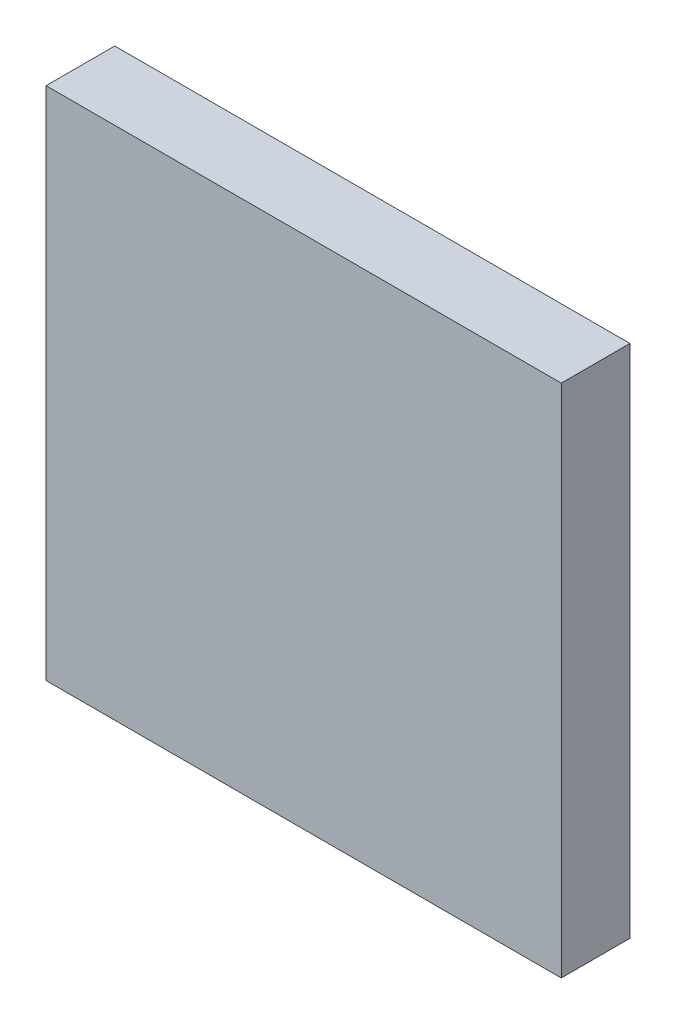
ISO-10303-21;
HEADER;
FILE_DESCRIPTION(('STEP AP214'),'2;1');
FILE_NAME('part.step','',(''),(''),'','','');
FILE_SCHEMA(('AUTOMOTIVE_DESIGN { 1 0 10303 214 1 1 1 1 }'));
ENDSEC;
DATA;
#1=APPLICATION_CONTEXT('core data for automotive mechanical design processes');
#2=APPLICATION_PROTOCOL_DEFINITION('international standard','automotive_design',2000,#1);
#3=PRODUCT_CONTEXT('',#1,'mechanical');
#4=PRODUCT('Part','Part','',(#3));
#5=PRODUCT_RELATED_PRODUCT_CATEGORY('part','',(#4));
#6=PRODUCT_DEFINITION_FORMATION('','',#4);
#7=PRODUCT_DEFINITION_CONTEXT('part definition',#1,'design');
#8=PRODUCT_DEFINITION('design','',#6,#7);
#9=PRODUCT_DEFINITION_SHAPE('','',#8);
#10=(LENGTH_UNIT() NAMED_UNIT(*) SI_UNIT(.MILLI.,.METRE.));
#11=(NAMED_UNIT(*) PLANE_ANGLE_UNIT() SI_UNIT($,.RADIAN.));
#12=(NAMED_UNIT(*) SI_UNIT($,.STERADIAN.) SOLID_ANGLE_UNIT());
#13=UNCERTAINTY_MEASURE_WITH_UNIT(LENGTH_MEASURE(1.E-05),#10,'distance_accuracy_value','');
#14=(GEOMETRIC_REPRESENTATION_CONTEXT(3) GLOBAL_UNCERTAINTY_ASSIGNED_CONTEXT((#13)) GLOBAL_UNIT_ASSIGNED_CONTEXT((#10,
#11,#12)) REPRESENTATION_CONTEXT('',''));
#15=CARTESIAN_POINT('',(0.,0.,0.));
#16=DIRECTION('',(0.,0.,1.));
#17=DIRECTION('',(1.,0.,0.));
#18=AXIS2_PLACEMENT_3D('',#15,#16,#17);
#19=CARTESIAN_POINT('',(75.,0.,170.));
#20=DIRECTION('',(-1.,0.,0.));
#21=DIRECTION('',(0.,-1.,0.));
#22=AXIS2_PLACEMENT_3D('',#19,#20,#21);
#23=PLANE('',#22);
#24=DIRECTION('',(0.,1.,0.));
#25=VECTOR('',#24,1.);
#26=CARTESIAN_POINT('',(75.,0.,150.));
#27=LINE('',#26,#25);
#28=CARTESIAN_POINT('',(75.,-150.,150.));
#29=VERTEX_POINT('',#28);
#30=CARTESIAN_POINT('',(75.,0.,150.));
#31=VERTEX_POINT('',#30);
#32=EDGE_CURVE('E113',#29,#31,#27,.T.);
#33=ORIENTED_EDGE('',*,*,#32,.T.);
#34=DIRECTION('',(0.,0.,-1.));
#35=VECTOR('',#34,1.);
#36=CARTESIAN_POINT('',(75.,0.,170.));
#37=LINE('',#36,#35);
#38=CARTESIAN_POINT('',(75.,0.,170.));
#39=VERTEX_POINT('',#38);
#40=EDGE_CURVE('E11',#39,#31,#37,.T.);
#41=ORIENTED_EDGE('',*,*,#40,.F.);
#42=DIRECTION('',(0.,1.,0.));
#43=VECTOR('',#42,1.);
#44=CARTESIAN_POINT('',(75.,0.,170.));
#45=LINE('',#44,#43);
#46=CARTESIAN_POINT('',(75.,-150.,170.));
#47=VERTEX_POINT('',#46);
#48=EDGE_CURVE('E97',#47,#39,#45,.T.);
#49=ORIENTED_EDGE('',*,*,#48,.F.);
#50=DIRECTION('',(0.,0.,-1.));
#51=VECTOR('',#50,1.);
#52=CARTESIAN_POINT('',(75.,-150.,170.));
#53=LINE('',#52,#51);
#54=EDGE_CURVE('E109',#47,#29,#53,.T.);
#55=ORIENTED_EDGE('',*,*,#54,.T.);
#56=EDGE_LOOP('',(#33,#41,#49,#55));
#57=FACE_BOUND('',#56,.T.);
#58=ADVANCED_FACE('F45',(#57),#23,.F.);
#59=CARTESIAN_POINT('',(-75.,0.,170.));
#60=DIRECTION('',(0.,-1.,0.));
#61=DIRECTION('',(0.,0.,-1.));
#62=AXIS2_PLACEMENT_3D('',#59,#60,#61);
#63=PLANE('',#62);
#64=DIRECTION('',(-1.,0.,0.));
#65=VECTOR('',#64,1.);
#66=CARTESIAN_POINT('',(-75.,0.,150.));
#67=LINE('',#66,#65);
#68=CARTESIAN_POINT('',(-75.,0.,150.));
#69=VERTEX_POINT('',#68);
#70=EDGE_CURVE('E102',#31,#69,#67,.T.);
#71=ORIENTED_EDGE('',*,*,#70,.T.);
#72=DIRECTION('',(0.,0.,-1.));
#73=VECTOR('',#72,1.);
#74=CARTESIAN_POINT('',(-75.,0.,170.));
#75=LINE('',#74,#73);
#76=CARTESIAN_POINT('',(-75.,0.,170.));
#77=VERTEX_POINT('',#76);
#78=EDGE_CURVE('E54',#77,#69,#75,.T.);
#79=ORIENTED_EDGE('',*,*,#78,.F.);
#80=DIRECTION('',(-1.,0.,0.));
#81=VECTOR('',#80,1.);
#82=CARTESIAN_POINT('',(-75.,0.,170.));
#83=LINE('',#82,#81);
#84=EDGE_CURVE('E92',#39,#77,#83,.T.);
#85=ORIENTED_EDGE('',*,*,#84,.F.);
#86=ORIENTED_EDGE('',*,*,#40,.T.);
#87=EDGE_LOOP('',(#71,#79,#85,#86));
#88=FACE_BOUND('',#87,.T.);
#89=ADVANCED_FACE('F101',(#88),#63,.F.);
#90=CARTESIAN_POINT('',(-75.,0.,170.));
#91=DIRECTION('',(1.,0.,0.));
#92=DIRECTION('',(0.,1.,0.));
#93=AXIS2_PLACEMENT_3D('',#90,#91,#92);
#94=PLANE('',#93);
#95=DIRECTION('',(0.,-1.,0.));
#96=VECTOR('',#95,1.);
#97=CARTESIAN_POINT('',(-75.,0.,150.));
#98=LINE('',#97,#96);
#99=CARTESIAN_POINT('',(-75.,-150.,150.));
#100=VERTEX_POINT('',#99);
#101=EDGE_CURVE('E79',#69,#100,#98,.T.);
#102=ORIENTED_EDGE('',*,*,#101,.T.);
#103=DIRECTION('',(0.,0.,-1.));
#104=VECTOR('',#103,1.);
#105=CARTESIAN_POINT('',(-75.,-150.,170.));
#106=LINE('',#105,#104);
#107=CARTESIAN_POINT('',(-75.,-150.,170.));
#108=VERTEX_POINT('',#107);
#109=EDGE_CURVE('E104',#108,#100,#106,.T.);
#110=ORIENTED_EDGE('',*,*,#109,.F.);
#111=DIRECTION('',(0.,-1.,0.));
#112=VECTOR('',#111,1.);
#113=CARTESIAN_POINT('',(-75.,0.,170.));
#114=LINE('',#113,#112);
#115=EDGE_CURVE('E95',#77,#108,#114,.T.);
#116=ORIENTED_EDGE('',*,*,#115,.F.);
#117=ORIENTED_EDGE('',*,*,#78,.T.);
#118=EDGE_LOOP('',(#102,#110,#116,#117));
#119=FACE_BOUND('',#118,.T.);
#120=ADVANCED_FACE('F105',(#119),#94,.F.);
#121=CARTESIAN_POINT('',(-75.,-150.,170.));
#122=DIRECTION('',(0.,1.,0.));
#123=DIRECTION('',(0.,0.,1.));
#124=AXIS2_PLACEMENT_3D('',#121,#122,#123);
#125=PLANE('',#124);
#126=DIRECTION('',(1.,0.,0.));
#127=VECTOR('',#126,1.);
#128=CARTESIAN_POINT('',(-75.,-150.,150.));
#129=LINE('',#128,#127);
#130=EDGE_CURVE('E85',#100,#29,#129,.T.);
#131=ORIENTED_EDGE('',*,*,#130,.T.);
#132=ORIENTED_EDGE('',*,*,#54,.F.);
#133=DIRECTION('',(1.,0.,0.));
#134=VECTOR('',#133,1.);
#135=CARTESIAN_POINT('',(-75.,-150.,170.));
#136=LINE('',#135,#134);
#137=EDGE_CURVE('E62',#108,#47,#136,.T.);
#138=ORIENTED_EDGE('',*,*,#137,.F.);
#139=ORIENTED_EDGE('',*,*,#109,.T.);
#140=EDGE_LOOP('',(#131,#132,#138,#139));
#141=FACE_BOUND('',#140,.T.);
#142=ADVANCED_FACE('F126',(#141),#125,.F.);
#143=CARTESIAN_POINT('',(0.,0.,170.));
#144=DIRECTION('',(0.,0.,1.));
#145=DIRECTION('',(1.,0.,0.));
#146=AXIS2_PLACEMENT_3D('',#143,#144,#145);
#147=PLANE('',#146);
#148=ORIENTED_EDGE('',*,*,#48,.T.);
#149=ORIENTED_EDGE('',*,*,#84,.T.);
#150=ORIENTED_EDGE('',*,*,#115,.T.);
#151=ORIENTED_EDGE('',*,*,#137,.T.);
#152=EDGE_LOOP('',(#148,#149,#150,#151));
#153=FACE_BOUND('',#152,.T.);
#154=ADVANCED_FACE('F93',(#153),#147,.T.);
#155=CARTESIAN_POINT('',(0.,0.,150.));
#156=DIRECTION('',(0.,0.,1.));
#157=DIRECTION('',(1.,0.,0.));
#158=AXIS2_PLACEMENT_3D('',#155,#156,#157);
#159=PLANE('',#158);
#160=ORIENTED_EDGE('',*,*,#32,.F.);
#161=ORIENTED_EDGE('',*,*,#130,.F.);
#162=ORIENTED_EDGE('',*,*,#101,.F.);
#163=ORIENTED_EDGE('',*,*,#70,.F.);
#164=EDGE_LOOP('',(#160,#161,#162,#163));
#165=FACE_BOUND('',#164,.T.);
#166=ADVANCED_FACE('F129',(#165),#159,.F.);
#167=CLOSED_SHELL('',(#58,#89,#120,#142,#154,#166));
#168=MANIFOLD_SOLID_BREP('B2',#167);
#169=ADVANCED_BREP_SHAPE_REPRESENTATION('',(#18,#168),#14);
#170=SHAPE_DEFINITION_REPRESENTATION(#9,#169);
ENDSEC;
END-ISO-10303-21;
